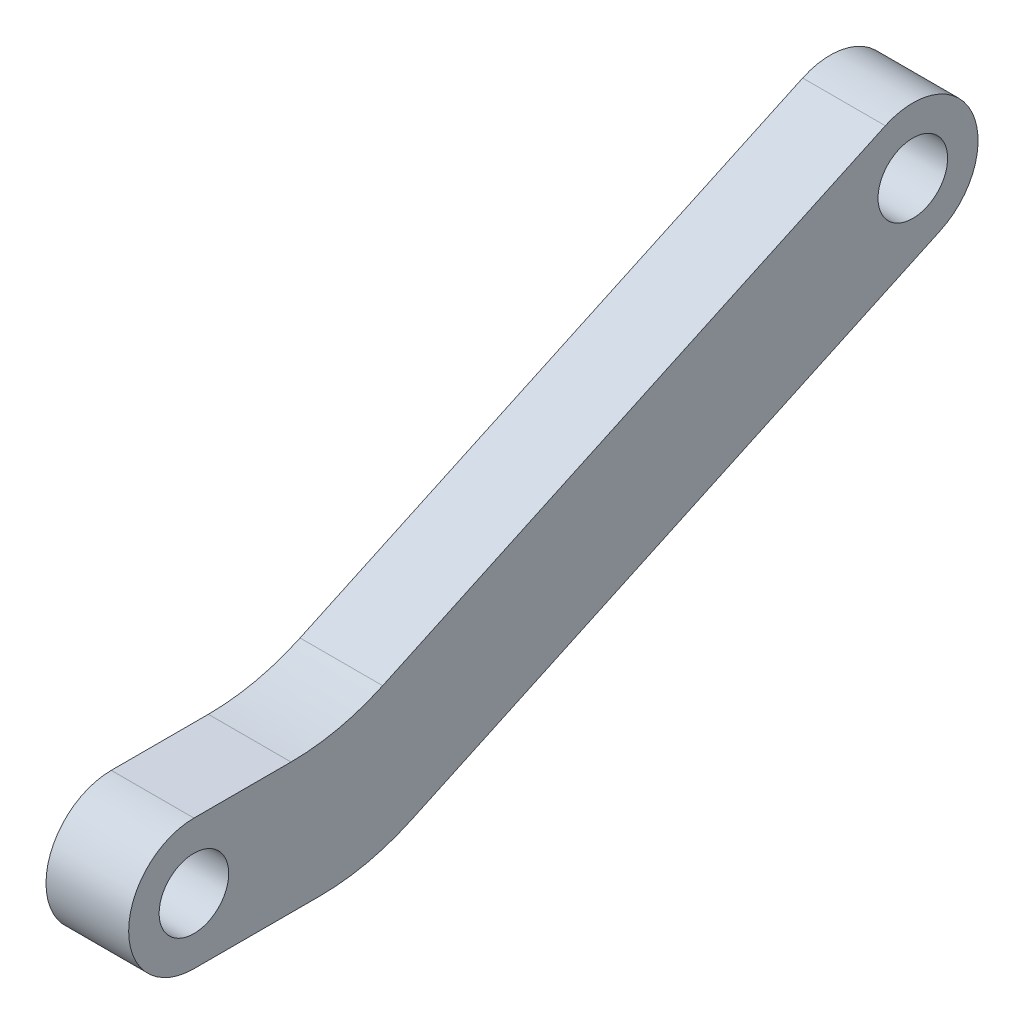
ISO-10303-21;
HEADER;
FILE_DESCRIPTION(('STEP AP214'),'2;1');
FILE_NAME('part.step','',(''),(''),'','','');
FILE_SCHEMA(('AUTOMOTIVE_DESIGN { 1 0 10303 214 1 1 1 1 }'));
ENDSEC;
DATA;
#1=APPLICATION_CONTEXT('core data for automotive mechanical design processes');
#2=APPLICATION_PROTOCOL_DEFINITION('international standard','automotive_design',2000,#1);
#3=PRODUCT_CONTEXT('',#1,'mechanical');
#4=PRODUCT('Part','Part','',(#3));
#5=PRODUCT_RELATED_PRODUCT_CATEGORY('part','',(#4));
#6=PRODUCT_DEFINITION_FORMATION('','',#4);
#7=PRODUCT_DEFINITION_CONTEXT('part definition',#1,'design');
#8=PRODUCT_DEFINITION('design','',#6,#7);
#9=PRODUCT_DEFINITION_SHAPE('','',#8);
#10=(LENGTH_UNIT() NAMED_UNIT(*) SI_UNIT(.MILLI.,.METRE.));
#11=(NAMED_UNIT(*) PLANE_ANGLE_UNIT() SI_UNIT($,.RADIAN.));
#12=(NAMED_UNIT(*) SI_UNIT($,.STERADIAN.) SOLID_ANGLE_UNIT());
#13=UNCERTAINTY_MEASURE_WITH_UNIT(LENGTH_MEASURE(1.E-05),#10,'distance_accuracy_value','');
#14=(GEOMETRIC_REPRESENTATION_CONTEXT(3) GLOBAL_UNCERTAINTY_ASSIGNED_CONTEXT((#13)) GLOBAL_UNIT_ASSIGNED_CONTEXT((#10,
#11,#12)) REPRESENTATION_CONTEXT('',''));
#15=CARTESIAN_POINT('',(0.,0.,0.));
#16=DIRECTION('',(0.,0.,1.));
#17=DIRECTION('',(1.,0.,0.));
#18=AXIS2_PLACEMENT_3D('',#15,#16,#17);
#19=CARTESIAN_POINT('',(1.9,11.95,-33.05));
#20=DIRECTION('',(1.,0.,0.));
#21=DIRECTION('',(0.,0.,-1.));
#22=AXIS2_PLACEMENT_3D('',#19,#20,#21);
#23=PLANE('',#22);
#24=CARTESIAN_POINT('',(1.9,0.,0.));
#25=DIRECTION('',(1.,0.,0.));
#26=DIRECTION('',(0.,0.,-1.));
#27=AXIS2_PLACEMENT_3D('',#24,#25,#26);
#28=CIRCLE('',#27,1.6);
#29=CARTESIAN_POINT('',(1.9,0.,1.6));
#30=VERTEX_POINT('',#29);
#31=EDGE_CURVE('E133',#30,#30,#28,.T.);
#32=ORIENTED_EDGE('',*,*,#31,.F.);
#33=EDGE_LOOP('',(#32));
#34=FACE_BOUND('',#33,.T.);
#35=CARTESIAN_POINT('',(1.9,11.95,-33.05));
#36=DIRECTION('',(1.,0.,0.));
#37=DIRECTION('',(0.,0.,-1.));
#38=AXIS2_PLACEMENT_3D('',#35,#36,#37);
#39=CIRCLE('',#38,3.);
#40=CARTESIAN_POINT('',(1.9,9.22944985128047,-34.3143602683975));
#41=VERTEX_POINT('',#40);
#42=CARTESIAN_POINT('',(1.9,14.6705501487195,-31.7856397316025));
#43=VERTEX_POINT('',#42);
#44=EDGE_CURVE('E144',#41,#43,#39,.T.);
#45=ORIENTED_EDGE('',*,*,#44,.T.);
#46=DIRECTION('',(0.,-0.421453422799161,0.906850049573176));
#47=VECTOR('',#46,1.);
#48=CARTESIAN_POINT('',(1.9,3.93149950426824,-8.67820227242124));
#49=LINE('',#48,#47);
#50=CARTESIAN_POINT('',(1.9,3.93149950426824,-8.67820227242124));
#51=VERTEX_POINT('',#50);
#52=EDGE_CURVE('E92',#43,#51,#49,.T.);
#53=ORIENTED_EDGE('',*,*,#52,.T.);
#54=CARTESIAN_POINT('',(1.9,13.,-4.46366804442963));
#55=DIRECTION('',(-1.,0.,0.));
#56=DIRECTION('',(0.,0.,-1.));
#57=AXIS2_PLACEMENT_3D('',#54,#55,#56);
#58=CIRCLE('',#57,10.);
#59=CARTESIAN_POINT('',(1.9,3.,-4.46366804442963));
#60=VERTEX_POINT('',#59);
#61=EDGE_CURVE('E159',#51,#60,#58,.T.);
#62=ORIENTED_EDGE('',*,*,#61,.T.);
#63=DIRECTION('',(0.,0.,1.));
#64=VECTOR('',#63,1.);
#65=CARTESIAN_POINT('',(1.9,3.,0.));
#66=LINE('',#65,#64);
#67=CARTESIAN_POINT('',(1.9,3.,0.));
#68=VERTEX_POINT('',#67);
#69=EDGE_CURVE('E172',#60,#68,#66,.T.);
#70=ORIENTED_EDGE('',*,*,#69,.T.);
#71=CARTESIAN_POINT('',(1.9,0.,0.));
#72=DIRECTION('',(1.,0.,0.));
#73=DIRECTION('',(0.,0.,-1.));
#74=AXIS2_PLACEMENT_3D('',#71,#72,#73);
#75=CIRCLE('',#74,3.);
#76=CARTESIAN_POINT('',(1.9,-3.,0.));
#77=VERTEX_POINT('',#76);
#78=EDGE_CURVE('E111',#68,#77,#75,.T.);
#79=ORIENTED_EDGE('',*,*,#78,.T.);
#80=DIRECTION('',(0.,0.,-1.));
#81=VECTOR('',#80,1.);
#82=CARTESIAN_POINT('',(1.9,-3.,0.));
#83=LINE('',#82,#81);
#84=CARTESIAN_POINT('',(1.9,-3.,-5.78979252776852));
#85=VERTEX_POINT('',#84);
#86=EDGE_CURVE('E105',#77,#85,#83,.T.);
#87=ORIENTED_EDGE('',*,*,#86,.T.);
#88=CARTESIAN_POINT('',(1.9,7.,-5.78979252776852));
#89=DIRECTION('',(1.,0.,0.));
#90=DIRECTION('',(0.,0.,-1.));
#91=AXIS2_PLACEMENT_3D('',#88,#89,#90);
#92=CIRCLE('',#91,10.);
#93=CARTESIAN_POINT('',(1.9,-2.06850049573176,-10.0043267557601));
#94=VERTEX_POINT('',#93);
#95=EDGE_CURVE('E109',#85,#94,#92,.T.);
#96=ORIENTED_EDGE('',*,*,#95,.T.);
#97=DIRECTION('',(0.,0.421453422799161,-0.906850049573176));
#98=VECTOR('',#97,1.);
#99=CARTESIAN_POINT('',(1.9,-2.06850049573176,-10.0043267557601));
#100=LINE('',#99,#98);
#101=EDGE_CURVE('E49',#94,#41,#100,.T.);
#102=ORIENTED_EDGE('',*,*,#101,.T.);
#103=EDGE_LOOP('',(#45,#53,#62,#70,#79,#87,#96,#102));
#104=FACE_BOUND('',#103,.T.);
#105=CARTESIAN_POINT('',(1.9,11.95,-33.05));
#106=DIRECTION('',(1.,0.,0.));
#107=DIRECTION('',(0.,0.,-1.));
#108=AXIS2_PLACEMENT_3D('',#105,#106,#107);
#109=CIRCLE('',#108,1.6);
#110=CARTESIAN_POINT('',(1.9,11.95,-31.45));
#111=VERTEX_POINT('',#110);
#112=EDGE_CURVE('E181',#111,#111,#109,.T.);
#113=ORIENTED_EDGE('',*,*,#112,.F.);
#114=EDGE_LOOP('',(#113));
#115=FACE_BOUND('',#114,.T.);
#116=ADVANCED_FACE('F32',(#34,#104,#115),#23,.T.);
#117=CARTESIAN_POINT('',(-1.9,11.95,-33.05));
#118=DIRECTION('',(1.,0.,0.));
#119=DIRECTION('',(0.,0.,-1.));
#120=AXIS2_PLACEMENT_3D('',#117,#118,#119);
#121=PLANE('',#120);
#122=CARTESIAN_POINT('',(-1.9,11.95,-33.05));
#123=DIRECTION('',(1.,0.,0.));
#124=DIRECTION('',(0.,0.,-1.));
#125=AXIS2_PLACEMENT_3D('',#122,#123,#124);
#126=CIRCLE('',#125,3.);
#127=CARTESIAN_POINT('',(-1.9,9.22944985128047,-34.3143602683975));
#128=VERTEX_POINT('',#127);
#129=CARTESIAN_POINT('',(-1.9,14.6705501487195,-31.7856397316025));
#130=VERTEX_POINT('',#129);
#131=EDGE_CURVE('E129',#128,#130,#126,.T.);
#132=ORIENTED_EDGE('',*,*,#131,.F.);
#133=DIRECTION('',(0.,0.421453422799161,-0.906850049573176));
#134=VECTOR('',#133,1.);
#135=CARTESIAN_POINT('',(-1.9,-2.06850049573176,-10.0043267557601));
#136=LINE('',#135,#134);
#137=CARTESIAN_POINT('',(-1.9,-2.06850049573176,-10.0043267557601));
#138=VERTEX_POINT('',#137);
#139=EDGE_CURVE('E84',#138,#128,#136,.T.);
#140=ORIENTED_EDGE('',*,*,#139,.F.);
#141=CARTESIAN_POINT('',(-1.9,7.,-5.78979252776852));
#142=DIRECTION('',(1.,0.,0.));
#143=DIRECTION('',(0.,0.,-1.));
#144=AXIS2_PLACEMENT_3D('',#141,#142,#143);
#145=CIRCLE('',#144,10.);
#146=CARTESIAN_POINT('',(-1.9,-3.,-5.78979252776852));
#147=VERTEX_POINT('',#146);
#148=EDGE_CURVE('E78',#147,#138,#145,.T.);
#149=ORIENTED_EDGE('',*,*,#148,.F.);
#150=DIRECTION('',(0.,0.,-1.));
#151=VECTOR('',#150,1.);
#152=CARTESIAN_POINT('',(-1.9,-3.,0.));
#153=LINE('',#152,#151);
#154=CARTESIAN_POINT('',(-1.9,-3.,0.));
#155=VERTEX_POINT('',#154);
#156=EDGE_CURVE('E119',#155,#147,#153,.T.);
#157=ORIENTED_EDGE('',*,*,#156,.F.);
#158=CARTESIAN_POINT('',(-1.9,0.,0.));
#159=DIRECTION('',(1.,0.,0.));
#160=DIRECTION('',(0.,0.,-1.));
#161=AXIS2_PLACEMENT_3D('',#158,#159,#160);
#162=CIRCLE('',#161,3.);
#163=CARTESIAN_POINT('',(-1.9,3.,0.));
#164=VERTEX_POINT('',#163);
#165=EDGE_CURVE('E139',#164,#155,#162,.T.);
#166=ORIENTED_EDGE('',*,*,#165,.F.);
#167=DIRECTION('',(0.,0.,1.));
#168=VECTOR('',#167,1.);
#169=CARTESIAN_POINT('',(-1.9,3.,0.));
#170=LINE('',#169,#168);
#171=CARTESIAN_POINT('',(-1.9,3.,-4.46366804442963));
#172=VERTEX_POINT('',#171);
#173=EDGE_CURVE('E137',#172,#164,#170,.T.);
#174=ORIENTED_EDGE('',*,*,#173,.F.);
#175=CARTESIAN_POINT('',(-1.9,13.,-4.46366804442963));
#176=DIRECTION('',(-1.,0.,0.));
#177=DIRECTION('',(0.,0.,-1.));
#178=AXIS2_PLACEMENT_3D('',#175,#176,#177);
#179=CIRCLE('',#178,10.);
#180=CARTESIAN_POINT('',(-1.9,3.93149950426824,-8.67820227242124));
#181=VERTEX_POINT('',#180);
#182=EDGE_CURVE('E135',#181,#172,#179,.T.);
#183=ORIENTED_EDGE('',*,*,#182,.F.);
#184=DIRECTION('',(0.,-0.421453422799161,0.906850049573176));
#185=VECTOR('',#184,1.);
#186=CARTESIAN_POINT('',(-1.9,3.93149950426824,-8.67820227242124));
#187=LINE('',#186,#185);
#188=EDGE_CURVE('E132',#130,#181,#187,.T.);
#189=ORIENTED_EDGE('',*,*,#188,.F.);
#190=EDGE_LOOP('',(#132,#140,#149,#157,#166,#174,#183,#189));
#191=FACE_BOUND('',#190,.T.);
#192=CARTESIAN_POINT('',(-1.9,0.,0.));
#193=DIRECTION('',(1.,0.,0.));
#194=DIRECTION('',(0.,0.,-1.));
#195=AXIS2_PLACEMENT_3D('',#192,#193,#194);
#196=CIRCLE('',#195,1.6);
#197=CARTESIAN_POINT('',(-1.9,0.,1.6));
#198=VERTEX_POINT('',#197);
#199=EDGE_CURVE('E178',#198,#198,#196,.T.);
#200=ORIENTED_EDGE('',*,*,#199,.T.);
#201=EDGE_LOOP('',(#200));
#202=FACE_BOUND('',#201,.T.);
#203=CARTESIAN_POINT('',(-1.9,11.95,-33.05));
#204=DIRECTION('',(1.,0.,0.));
#205=DIRECTION('',(0.,0.,-1.));
#206=AXIS2_PLACEMENT_3D('',#203,#204,#205);
#207=CIRCLE('',#206,1.6);
#208=CARTESIAN_POINT('',(-1.9,11.95,-31.45));
#209=VERTEX_POINT('',#208);
#210=EDGE_CURVE('E184',#209,#209,#207,.T.);
#211=ORIENTED_EDGE('',*,*,#210,.T.);
#212=EDGE_LOOP('',(#211));
#213=FACE_BOUND('',#212,.T.);
#214=ADVANCED_FACE('F163',(#191,#202,#213),#121,.F.);
#215=CARTESIAN_POINT('',(1.9,11.95,-33.05));
#216=DIRECTION('',(-1.,0.,0.));
#217=DIRECTION('',(0.,0.,1.));
#218=AXIS2_PLACEMENT_3D('',#215,#216,#217);
#219=CYLINDRICAL_SURFACE('',#218,3.);
#220=ORIENTED_EDGE('',*,*,#131,.T.);
#221=DIRECTION('',(-1.,0.,0.));
#222=VECTOR('',#221,1.);
#223=CARTESIAN_POINT('',(1.9,14.6705501487195,-31.7856397316025));
#224=LINE('',#223,#222);
#225=EDGE_CURVE('E11',#43,#130,#224,.T.);
#226=ORIENTED_EDGE('',*,*,#225,.F.);
#227=ORIENTED_EDGE('',*,*,#44,.F.);
#228=DIRECTION('',(-1.,0.,0.));
#229=VECTOR('',#228,1.);
#230=CARTESIAN_POINT('',(1.9,9.22944985128047,-34.3143602683975));
#231=LINE('',#230,#229);
#232=EDGE_CURVE('E125',#41,#128,#231,.T.);
#233=ORIENTED_EDGE('',*,*,#232,.T.);
#234=EDGE_LOOP('',(#220,#226,#227,#233));
#235=FACE_BOUND('',#234,.T.);
#236=ADVANCED_FACE('F34',(#235),#219,.T.);
#237=CARTESIAN_POINT('',(1.9,3.93149950426824,-8.67820227242124));
#238=DIRECTION('',(0.,-0.906850049573176,-0.421453422799161));
#239=DIRECTION('',(0.,0.421453422799161,-0.906850049573176));
#240=AXIS2_PLACEMENT_3D('',#237,#238,#239);
#241=PLANE('',#240);
#242=ORIENTED_EDGE('',*,*,#188,.T.);
#243=DIRECTION('',(-1.,0.,0.));
#244=VECTOR('',#243,1.);
#245=CARTESIAN_POINT('',(1.9,3.93149950426824,-8.67820227242124));
#246=LINE('',#245,#244);
#247=EDGE_CURVE('E41',#51,#181,#246,.T.);
#248=ORIENTED_EDGE('',*,*,#247,.F.);
#249=ORIENTED_EDGE('',*,*,#52,.F.);
#250=ORIENTED_EDGE('',*,*,#225,.T.);
#251=EDGE_LOOP('',(#242,#248,#249,#250));
#252=FACE_BOUND('',#251,.T.);
#253=ADVANCED_FACE('F216',(#252),#241,.F.);
#254=CARTESIAN_POINT('',(1.9,13.,-4.46366804442963));
#255=DIRECTION('',(-1.,0.,0.));
#256=DIRECTION('',(0.,0.,1.));
#257=AXIS2_PLACEMENT_3D('',#254,#255,#256);
#258=CYLINDRICAL_SURFACE('',#257,10.);
#259=ORIENTED_EDGE('',*,*,#182,.T.);
#260=DIRECTION('',(-1.,0.,0.));
#261=VECTOR('',#260,1.);
#262=CARTESIAN_POINT('',(1.9,3.,-4.46366804442963));
#263=LINE('',#262,#261);
#264=EDGE_CURVE('E151',#60,#172,#263,.T.);
#265=ORIENTED_EDGE('',*,*,#264,.F.);
#266=ORIENTED_EDGE('',*,*,#61,.F.);
#267=ORIENTED_EDGE('',*,*,#247,.T.);
#268=EDGE_LOOP('',(#259,#265,#266,#267));
#269=FACE_BOUND('',#268,.T.);
#270=ADVANCED_FACE('F157',(#269),#258,.F.);
#271=CARTESIAN_POINT('',(1.9,3.,0.));
#272=DIRECTION('',(0.,-1.,0.));
#273=DIRECTION('',(0.,0.,-1.));
#274=AXIS2_PLACEMENT_3D('',#271,#272,#273);
#275=PLANE('',#274);
#276=ORIENTED_EDGE('',*,*,#173,.T.);
#277=DIRECTION('',(-1.,0.,0.));
#278=VECTOR('',#277,1.);
#279=CARTESIAN_POINT('',(1.9,3.,0.));
#280=LINE('',#279,#278);
#281=EDGE_CURVE('E148',#68,#164,#280,.T.);
#282=ORIENTED_EDGE('',*,*,#281,.F.);
#283=ORIENTED_EDGE('',*,*,#69,.F.);
#284=ORIENTED_EDGE('',*,*,#264,.T.);
#285=EDGE_LOOP('',(#276,#282,#283,#284));
#286=FACE_BOUND('',#285,.T.);
#287=ADVANCED_FACE('F168',(#286),#275,.F.);
#288=CARTESIAN_POINT('',(1.9,0.,0.));
#289=DIRECTION('',(-1.,0.,0.));
#290=DIRECTION('',(0.,0.,1.));
#291=AXIS2_PLACEMENT_3D('',#288,#289,#290);
#292=CYLINDRICAL_SURFACE('',#291,3.);
#293=ORIENTED_EDGE('',*,*,#165,.T.);
#294=DIRECTION('',(-1.,0.,0.));
#295=VECTOR('',#294,1.);
#296=CARTESIAN_POINT('',(1.9,-3.,0.));
#297=LINE('',#296,#295);
#298=EDGE_CURVE('E120',#77,#155,#297,.T.);
#299=ORIENTED_EDGE('',*,*,#298,.F.);
#300=ORIENTED_EDGE('',*,*,#78,.F.);
#301=ORIENTED_EDGE('',*,*,#281,.T.);
#302=EDGE_LOOP('',(#293,#299,#300,#301));
#303=FACE_BOUND('',#302,.T.);
#304=ADVANCED_FACE('F171',(#303),#292,.T.);
#305=CARTESIAN_POINT('',(1.9,-3.,0.));
#306=DIRECTION('',(0.,1.,0.));
#307=DIRECTION('',(0.,0.,1.));
#308=AXIS2_PLACEMENT_3D('',#305,#306,#307);
#309=PLANE('',#308);
#310=ORIENTED_EDGE('',*,*,#156,.T.);
#311=DIRECTION('',(-1.,0.,0.));
#312=VECTOR('',#311,1.);
#313=CARTESIAN_POINT('',(1.9,-3.,-5.78979252776852));
#314=LINE('',#313,#312);
#315=EDGE_CURVE('E116',#85,#147,#314,.T.);
#316=ORIENTED_EDGE('',*,*,#315,.F.);
#317=ORIENTED_EDGE('',*,*,#86,.F.);
#318=ORIENTED_EDGE('',*,*,#298,.T.);
#319=EDGE_LOOP('',(#310,#316,#317,#318));
#320=FACE_BOUND('',#319,.T.);
#321=ADVANCED_FACE('F117',(#320),#309,.F.);
#322=CARTESIAN_POINT('',(1.9,7.,-5.78979252776852));
#323=DIRECTION('',(-1.,0.,0.));
#324=DIRECTION('',(0.,0.,1.));
#325=AXIS2_PLACEMENT_3D('',#322,#323,#324);
#326=CYLINDRICAL_SURFACE('',#325,10.);
#327=ORIENTED_EDGE('',*,*,#148,.T.);
#328=DIRECTION('',(-1.,0.,0.));
#329=VECTOR('',#328,1.);
#330=CARTESIAN_POINT('',(1.9,-2.06850049573176,-10.0043267557601));
#331=LINE('',#330,#329);
#332=EDGE_CURVE('E121',#94,#138,#331,.T.);
#333=ORIENTED_EDGE('',*,*,#332,.F.);
#334=ORIENTED_EDGE('',*,*,#95,.F.);
#335=ORIENTED_EDGE('',*,*,#315,.T.);
#336=EDGE_LOOP('',(#327,#333,#334,#335));
#337=FACE_BOUND('',#336,.T.);
#338=ADVANCED_FACE('F123',(#337),#326,.T.);
#339=CARTESIAN_POINT('',(1.9,-2.06850049573176,-10.0043267557601));
#340=DIRECTION('',(0.,0.906850049573176,0.421453422799161));
#341=DIRECTION('',(0.,-0.421453422799161,0.906850049573176));
#342=AXIS2_PLACEMENT_3D('',#339,#340,#341);
#343=PLANE('',#342);
#344=ORIENTED_EDGE('',*,*,#139,.T.);
#345=ORIENTED_EDGE('',*,*,#232,.F.);
#346=ORIENTED_EDGE('',*,*,#101,.F.);
#347=ORIENTED_EDGE('',*,*,#332,.T.);
#348=EDGE_LOOP('',(#344,#345,#346,#347));
#349=FACE_BOUND('',#348,.T.);
#350=ADVANCED_FACE('F204',(#349),#343,.F.);
#351=CARTESIAN_POINT('',(1.9,0.,0.));
#352=DIRECTION('',(-1.,0.,0.));
#353=DIRECTION('',(0.,0.,1.));
#354=AXIS2_PLACEMENT_3D('',#351,#352,#353);
#355=CYLINDRICAL_SURFACE('',#354,1.6);
#356=CARTESIAN_POINT('',(1.9,0.,1.6));
#357=CARTESIAN_POINT('',(1.86041666666667,0.,1.6));
#358=CARTESIAN_POINT('',(1.82083333333333,0.,1.6));
#359=CARTESIAN_POINT('',(1.74166666666667,0.,1.6));
#360=CARTESIAN_POINT('',(1.70208333333333,0.,1.6));
#361=CARTESIAN_POINT('',(1.62291666666667,0.,1.6));
#362=CARTESIAN_POINT('',(1.58333333333333,0.,1.6));
#363=CARTESIAN_POINT('',(1.50416666666667,0.,1.6));
#364=CARTESIAN_POINT('',(1.46458333333333,0.,1.6));
#365=CARTESIAN_POINT('',(1.38541666666667,0.,1.6));
#366=CARTESIAN_POINT('',(1.34583333333333,0.,1.6));
#367=CARTESIAN_POINT('',(1.26666666666667,0.,1.6));
#368=CARTESIAN_POINT('',(1.22708333333333,0.,1.6));
#369=CARTESIAN_POINT('',(1.14791666666667,0.,1.6));
#370=CARTESIAN_POINT('',(1.10833333333333,0.,1.6));
#371=CARTESIAN_POINT('',(1.02916666666667,0.,1.6));
#372=CARTESIAN_POINT('',(0.989583333333333,0.,1.6));
#373=CARTESIAN_POINT('',(0.910416666666667,0.,1.6));
#374=CARTESIAN_POINT('',(0.870833333333333,0.,1.6));
#375=CARTESIAN_POINT('',(0.791666666666667,0.,1.6));
#376=CARTESIAN_POINT('',(0.752083333333333,0.,1.6));
#377=CARTESIAN_POINT('',(0.672916666666666,0.,1.6));
#378=CARTESIAN_POINT('',(0.633333333333333,0.,1.6));
#379=CARTESIAN_POINT('',(0.554166666666667,0.,1.6));
#380=CARTESIAN_POINT('',(0.514583333333333,0.,1.6));
#381=CARTESIAN_POINT('',(0.435416666666667,0.,1.6));
#382=CARTESIAN_POINT('',(0.395833333333333,0.,1.6));
#383=CARTESIAN_POINT('',(0.316666666666666,0.,1.6));
#384=CARTESIAN_POINT('',(0.277083333333333,0.,1.6));
#385=CARTESIAN_POINT('',(0.197916666666666,0.,1.6));
#386=CARTESIAN_POINT('',(0.158333333333333,0.,1.6));
#387=CARTESIAN_POINT('',(0.0791666666666664,0.,1.6));
#388=CARTESIAN_POINT('',(0.0395833333333331,0.,1.6));
#389=CARTESIAN_POINT('',(-0.0395833333333334,0.,1.6));
#390=CARTESIAN_POINT('',(-0.0791666666666665,0.,1.6));
#391=CARTESIAN_POINT('',(-0.158333333333333,0.,1.6));
#392=CARTESIAN_POINT('',(-0.197916666666666,0.,1.6));
#393=CARTESIAN_POINT('',(-0.277083333333333,0.,1.6));
#394=CARTESIAN_POINT('',(-0.316666666666667,0.,1.6));
#395=CARTESIAN_POINT('',(-0.395833333333333,0.,1.6));
#396=CARTESIAN_POINT('',(-0.435416666666667,0.,1.6));
#397=CARTESIAN_POINT('',(-0.514583333333333,0.,1.6));
#398=CARTESIAN_POINT('',(-0.554166666666667,0.,1.6));
#399=CARTESIAN_POINT('',(-0.633333333333333,0.,1.6));
#400=CARTESIAN_POINT('',(-0.672916666666666,0.,1.6));
#401=CARTESIAN_POINT('',(-0.752083333333333,0.,1.6));
#402=CARTESIAN_POINT('',(-0.791666666666666,0.,1.6));
#403=CARTESIAN_POINT('',(-0.870833333333333,0.,1.6));
#404=CARTESIAN_POINT('',(-0.910416666666666,0.,1.6));
#405=CARTESIAN_POINT('',(-0.989583333333333,0.,1.6));
#406=CARTESIAN_POINT('',(-1.02916666666667,0.,1.6));
#407=CARTESIAN_POINT('',(-1.10833333333333,0.,1.6));
#408=CARTESIAN_POINT('',(-1.14791666666667,0.,1.6));
#409=CARTESIAN_POINT('',(-1.22708333333333,0.,1.6));
#410=CARTESIAN_POINT('',(-1.26666666666667,0.,1.6));
#411=CARTESIAN_POINT('',(-1.34583333333333,0.,1.6));
#412=CARTESIAN_POINT('',(-1.38541666666667,0.,1.6));
#413=CARTESIAN_POINT('',(-1.46458333333333,0.,1.6));
#414=CARTESIAN_POINT('',(-1.50416666666667,0.,1.6));
#415=CARTESIAN_POINT('',(-1.58333333333333,0.,1.6));
#416=CARTESIAN_POINT('',(-1.62291666666667,0.,1.6));
#417=CARTESIAN_POINT('',(-1.70208333333333,0.,1.6));
#418=CARTESIAN_POINT('',(-1.74166666666667,0.,1.6));
#419=CARTESIAN_POINT('',(-1.82083333333333,0.,1.6));
#420=CARTESIAN_POINT('',(-1.86041666666667,0.,1.6));
#421=CARTESIAN_POINT('',(-1.9,0.,1.6));
#422=B_SPLINE_CURVE_WITH_KNOTS('',3,(#356,#357,#358,#359,#360,#361,#362,#363,#364,#365,#366,
#367,#368,#369,#370,#371,#372,#373,#374,#375,#376,#377,#378,#379,#380,#381,#382,#383,#384,#385,
#386,#387,#388,#389,#390,#391,#392,#393,#394,#395,#396,#397,#398,#399,#400,#401,#402,#403,#404,
#405,#406,#407,#408,#409,#410,#411,#412,#413,#414,#415,#416,#417,#418,#419,#420,#421),
.UNSPECIFIED.,.F.,.F.,(4,2,2,2,2,2,2,2,2,2,2,2,2,2,2,2,2,2,2,2,2,2,2,2,2,2,2,2,2,2,2,2,4),(0.,
0.11875,0.2375,0.35625,0.475,0.59375,0.7125,0.83125,0.95,1.06875,1.1875,1.30625,1.425,1.54375,
1.6625,1.78125,1.9,2.01875,2.1375,2.25625,2.375,2.49375,2.6125,2.73125,2.85,2.96875,3.0875,
3.20625,3.325,3.44375,3.5625,3.68125,3.8),.UNSPECIFIED.);
#423=EDGE_CURVE('BSEAM201',#30,#198,#422,.T.);
#424=ORIENTED_EDGE('',*,*,#31,.T.);
#425=ORIENTED_EDGE('',*,*,#199,.F.);
#426=ORIENTED_EDGE('',*,*,#423,.T.);
#427=ORIENTED_EDGE('',*,*,#423,.F.);
#428=EDGE_LOOP('',(#424,#426,#425,#427));
#429=FACE_BOUND('',#428,.T.);
#430=ADVANCED_FACE('F201',(#429),#355,.F.);
#431=CARTESIAN_POINT('',(1.9,11.95,-33.05));
#432=DIRECTION('',(-1.,0.,0.));
#433=DIRECTION('',(0.,0.,1.));
#434=AXIS2_PLACEMENT_3D('',#431,#432,#433);
#435=CYLINDRICAL_SURFACE('',#434,1.6);
#436=CARTESIAN_POINT('',(1.9,11.95,-31.45));
#437=CARTESIAN_POINT('',(1.86041666666667,11.95,-31.45));
#438=CARTESIAN_POINT('',(1.82083333333333,11.95,-31.45));
#439=CARTESIAN_POINT('',(1.74166666666667,11.95,-31.45));
#440=CARTESIAN_POINT('',(1.70208333333333,11.95,-31.45));
#441=CARTESIAN_POINT('',(1.62291666666667,11.95,-31.45));
#442=CARTESIAN_POINT('',(1.58333333333333,11.95,-31.45));
#443=CARTESIAN_POINT('',(1.50416666666667,11.95,-31.45));
#444=CARTESIAN_POINT('',(1.46458333333333,11.95,-31.45));
#445=CARTESIAN_POINT('',(1.38541666666667,11.95,-31.45));
#446=CARTESIAN_POINT('',(1.34583333333333,11.95,-31.45));
#447=CARTESIAN_POINT('',(1.26666666666667,11.95,-31.45));
#448=CARTESIAN_POINT('',(1.22708333333333,11.95,-31.45));
#449=CARTESIAN_POINT('',(1.14791666666667,11.95,-31.45));
#450=CARTESIAN_POINT('',(1.10833333333333,11.95,-31.45));
#451=CARTESIAN_POINT('',(1.02916666666667,11.95,-31.45));
#452=CARTESIAN_POINT('',(0.989583333333333,11.95,-31.45));
#453=CARTESIAN_POINT('',(0.910416666666667,11.95,-31.45));
#454=CARTESIAN_POINT('',(0.870833333333333,11.95,-31.45));
#455=CARTESIAN_POINT('',(0.791666666666667,11.95,-31.45));
#456=CARTESIAN_POINT('',(0.752083333333333,11.95,-31.45));
#457=CARTESIAN_POINT('',(0.672916666666666,11.95,-31.45));
#458=CARTESIAN_POINT('',(0.633333333333333,11.95,-31.45));
#459=CARTESIAN_POINT('',(0.554166666666667,11.95,-31.45));
#460=CARTESIAN_POINT('',(0.514583333333333,11.95,-31.45));
#461=CARTESIAN_POINT('',(0.435416666666667,11.95,-31.45));
#462=CARTESIAN_POINT('',(0.395833333333333,11.95,-31.45));
#463=CARTESIAN_POINT('',(0.316666666666666,11.95,-31.45));
#464=CARTESIAN_POINT('',(0.277083333333333,11.95,-31.45));
#465=CARTESIAN_POINT('',(0.197916666666666,11.95,-31.45));
#466=CARTESIAN_POINT('',(0.158333333333333,11.95,-31.45));
#467=CARTESIAN_POINT('',(0.0791666666666664,11.95,-31.45));
#468=CARTESIAN_POINT('',(0.0395833333333331,11.95,-31.45));
#469=CARTESIAN_POINT('',(-0.0395833333333334,11.95,-31.45));
#470=CARTESIAN_POINT('',(-0.0791666666666665,11.95,-31.45));
#471=CARTESIAN_POINT('',(-0.158333333333333,11.95,-31.45));
#472=CARTESIAN_POINT('',(-0.197916666666666,11.95,-31.45));
#473=CARTESIAN_POINT('',(-0.277083333333333,11.95,-31.45));
#474=CARTESIAN_POINT('',(-0.316666666666667,11.95,-31.45));
#475=CARTESIAN_POINT('',(-0.395833333333333,11.95,-31.45));
#476=CARTESIAN_POINT('',(-0.435416666666667,11.95,-31.45));
#477=CARTESIAN_POINT('',(-0.514583333333333,11.95,-31.45));
#478=CARTESIAN_POINT('',(-0.554166666666667,11.95,-31.45));
#479=CARTESIAN_POINT('',(-0.633333333333333,11.95,-31.45));
#480=CARTESIAN_POINT('',(-0.672916666666666,11.95,-31.45));
#481=CARTESIAN_POINT('',(-0.752083333333333,11.95,-31.45));
#482=CARTESIAN_POINT('',(-0.791666666666666,11.95,-31.45));
#483=CARTESIAN_POINT('',(-0.870833333333333,11.95,-31.45));
#484=CARTESIAN_POINT('',(-0.910416666666666,11.95,-31.45));
#485=CARTESIAN_POINT('',(-0.989583333333333,11.95,-31.45));
#486=CARTESIAN_POINT('',(-1.02916666666667,11.95,-31.45));
#487=CARTESIAN_POINT('',(-1.10833333333333,11.95,-31.45));
#488=CARTESIAN_POINT('',(-1.14791666666667,11.95,-31.45));
#489=CARTESIAN_POINT('',(-1.22708333333333,11.95,-31.45));
#490=CARTESIAN_POINT('',(-1.26666666666667,11.95,-31.45));
#491=CARTESIAN_POINT('',(-1.34583333333333,11.95,-31.45));
#492=CARTESIAN_POINT('',(-1.38541666666667,11.95,-31.45));
#493=CARTESIAN_POINT('',(-1.46458333333333,11.95,-31.45));
#494=CARTESIAN_POINT('',(-1.50416666666667,11.95,-31.45));
#495=CARTESIAN_POINT('',(-1.58333333333333,11.95,-31.45));
#496=CARTESIAN_POINT('',(-1.62291666666667,11.95,-31.45));
#497=CARTESIAN_POINT('',(-1.70208333333333,11.95,-31.45));
#498=CARTESIAN_POINT('',(-1.74166666666667,11.95,-31.45));
#499=CARTESIAN_POINT('',(-1.82083333333333,11.95,-31.45));
#500=CARTESIAN_POINT('',(-1.86041666666667,11.95,-31.45));
#501=CARTESIAN_POINT('',(-1.9,11.95,-31.45));
#502=B_SPLINE_CURVE_WITH_KNOTS('',3,(#436,#437,#438,#439,#440,#441,#442,#443,#444,#445,#446,
#447,#448,#449,#450,#451,#452,#453,#454,#455,#456,#457,#458,#459,#460,#461,#462,#463,#464,#465,
#466,#467,#468,#469,#470,#471,#472,#473,#474,#475,#476,#477,#478,#479,#480,#481,#482,#483,#484,
#485,#486,#487,#488,#489,#490,#491,#492,#493,#494,#495,#496,#497,#498,#499,#500,#501),
.UNSPECIFIED.,.F.,.F.,(4,2,2,2,2,2,2,2,2,2,2,2,2,2,2,2,2,2,2,2,2,2,2,2,2,2,2,2,2,2,2,2,4),(0.,
0.11875,0.2375,0.35625,0.475,0.59375,0.7125,0.83125,0.95,1.06875,1.1875,1.30625,1.425,1.54375,
1.6625,1.78125,1.9,2.01875,2.1375,2.25625,2.375,2.49375,2.6125,2.73125,2.85,2.96875,3.0875,
3.20625,3.325,3.44375,3.5625,3.68125,3.8),.UNSPECIFIED.);
#503=EDGE_CURVE('BSEAM190',#111,#209,#502,.T.);
#504=ORIENTED_EDGE('',*,*,#112,.T.);
#505=ORIENTED_EDGE('',*,*,#210,.F.);
#506=ORIENTED_EDGE('',*,*,#503,.T.);
#507=ORIENTED_EDGE('',*,*,#503,.F.);
#508=EDGE_LOOP('',(#504,#506,#505,#507));
#509=FACE_BOUND('',#508,.T.);
#510=ADVANCED_FACE('F190',(#509),#435,.F.);
#511=CLOSED_SHELL('',(#116,#214,#236,#253,#270,#287,#304,#321,#338,#350,#430,#510));
#512=MANIFOLD_SOLID_BREP('B2',#511);
#513=ADVANCED_BREP_SHAPE_REPRESENTATION('',(#18,#512),#14);
#514=SHAPE_DEFINITION_REPRESENTATION(#9,#513);
ENDSEC;
END-ISO-10303-21;
